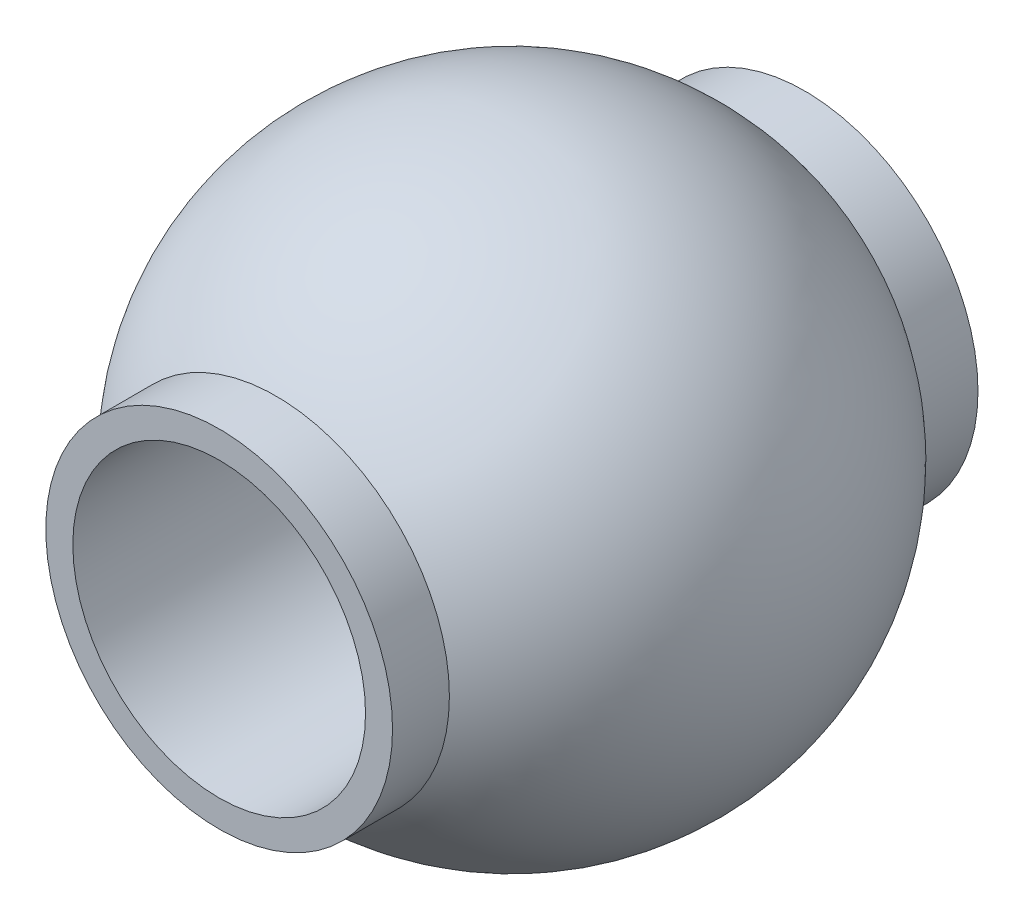
ISO-10303-21;
HEADER;
FILE_DESCRIPTION(('STEP AP214'),'2;1');
FILE_NAME('part.step','',(''),(''),'','','');
FILE_SCHEMA(('AUTOMOTIVE_DESIGN { 1 0 10303 214 1 1 1 1 }'));
ENDSEC;
DATA;
#1=APPLICATION_CONTEXT('core data for automotive mechanical design processes');
#2=APPLICATION_PROTOCOL_DEFINITION('international standard','automotive_design',2000,#1);
#3=PRODUCT_CONTEXT('',#1,'mechanical');
#4=PRODUCT('Part','Part','',(#3));
#5=PRODUCT_RELATED_PRODUCT_CATEGORY('part','',(#4));
#6=PRODUCT_DEFINITION_FORMATION('','',#4);
#7=PRODUCT_DEFINITION_CONTEXT('part definition',#1,'design');
#8=PRODUCT_DEFINITION('design','',#6,#7);
#9=PRODUCT_DEFINITION_SHAPE('','',#8);
#10=(LENGTH_UNIT() NAMED_UNIT(*) SI_UNIT(.MILLI.,.METRE.));
#11=(NAMED_UNIT(*) PLANE_ANGLE_UNIT() SI_UNIT($,.RADIAN.));
#12=(NAMED_UNIT(*) SI_UNIT($,.STERADIAN.) SOLID_ANGLE_UNIT());
#13=UNCERTAINTY_MEASURE_WITH_UNIT(LENGTH_MEASURE(1.E-05),#10,'distance_accuracy_value','');
#14=(GEOMETRIC_REPRESENTATION_CONTEXT(3) GLOBAL_UNCERTAINTY_ASSIGNED_CONTEXT((#13)) GLOBAL_UNIT_ASSIGNED_CONTEXT((#10,
#11,#12)) REPRESENTATION_CONTEXT('',''));
#15=CARTESIAN_POINT('',(0.,0.,0.));
#16=DIRECTION('',(0.,0.,1.));
#17=DIRECTION('',(1.,0.,0.));
#18=AXIS2_PLACEMENT_3D('',#15,#16,#17);
#19=CARTESIAN_POINT('',(0.,0.,0.));
#20=DIRECTION('',(0.,1.,0.));
#21=DIRECTION('',(1.,0.,0.));
#22=AXIS2_PLACEMENT_3D('',#19,#20,#21);
#23=SPHERICAL_SURFACE('',#22,3.);
#24=CARTESIAN_POINT('',(0.,0.,0.));
#25=DIRECTION('',(0.,0.,-1.));
#26=DIRECTION('',(-1.,0.,0.));
#27=AXIS2_PLACEMENT_3D('',#24,#25,#26);
#28=SPHERICAL_SURFACE('',#27,3.);
#29=CARTESIAN_POINT('',(0.,0.,2.41726372921671));
#30=DIRECTION('',(0.,0.,-1.));
#31=DIRECTION('',(-1.,0.,0.));
#32=AXIS2_PLACEMENT_3D('',#29,#30,#31);
#33=CIRCLE('',#32,1.77674873389946);
#34=CARTESIAN_POINT('',(-1.77674873389946,0.,2.41726372921671));
#35=VERTEX_POINT('',#34);
#36=EDGE_CURVE('E10',#35,#35,#33,.F.);
#37=ORIENTED_EDGE('',*,*,#36,.F.);
#38=EDGE_LOOP('',(#37));
#39=FACE_BOUND('',#38,.T.);
#40=CARTESIAN_POINT('',(0.,0.,-2.41726372921671));
#41=DIRECTION('',(0.,0.,1.));
#42=DIRECTION('',(1.,0.,0.));
#43=AXIS2_PLACEMENT_3D('',#40,#41,#42);
#44=CIRCLE('',#43,1.77674873389946);
#45=CARTESIAN_POINT('',(1.77674873389946,0.,-2.41726372921671));
#46=VERTEX_POINT('',#45);
#47=EDGE_CURVE('E37',#46,#46,#44,.F.);
#48=ORIENTED_EDGE('',*,*,#47,.F.);
#49=EDGE_LOOP('',(#48));
#50=FACE_BOUND('',#49,.T.);
#51=ADVANCED_FACE('F31',(#39,#50),#28,.T.);
#52=CARTESIAN_POINT('',(0.,0.,-3.));
#53=DIRECTION('',(0.,0.,1.));
#54=DIRECTION('',(1.,0.,0.));
#55=AXIS2_PLACEMENT_3D('',#52,#53,#54);
#56=CYLINDRICAL_SURFACE('',#55,1.77674873389946);
#57=ORIENTED_EDGE('',*,*,#47,.T.);
#58=EDGE_LOOP('',(#57));
#59=FACE_BOUND('',#58,.T.);
#60=CARTESIAN_POINT('',(0.,0.,-3.));
#61=DIRECTION('',(0.,0.,1.));
#62=DIRECTION('',(1.,0.,0.));
#63=AXIS2_PLACEMENT_3D('',#60,#61,#62);
#64=CIRCLE('',#63,1.77674873389946);
#65=CARTESIAN_POINT('',(1.77674873389946,0.,-3.));
#66=VERTEX_POINT('',#65);
#67=EDGE_CURVE('E41',#66,#66,#64,.T.);
#68=ORIENTED_EDGE('',*,*,#67,.T.);
#69=EDGE_LOOP('',(#68));
#70=FACE_BOUND('',#69,.T.);
#71=ADVANCED_FACE('F71',(#59,#70),#56,.T.);
#72=CARTESIAN_POINT('',(0.,0.,-3.));
#73=DIRECTION('',(0.,0.,1.));
#74=DIRECTION('',(1.,0.,0.));
#75=AXIS2_PLACEMENT_3D('',#72,#73,#74);
#76=PLANE('',#75);
#77=CARTESIAN_POINT('',(0.,0.,-3.));
#78=DIRECTION('',(0.,0.,1.));
#79=DIRECTION('',(1.,0.,0.));
#80=AXIS2_PLACEMENT_3D('',#77,#78,#79);
#81=CIRCLE('',#80,1.5);
#82=CARTESIAN_POINT('',(1.5,0.,-3.));
#83=VERTEX_POINT('',#82);
#84=EDGE_CURVE('E45',#83,#83,#81,.T.);
#85=ORIENTED_EDGE('',*,*,#84,.T.);
#86=EDGE_LOOP('',(#85));
#87=FACE_BOUND('',#86,.T.);
#88=ORIENTED_EDGE('',*,*,#67,.F.);
#89=EDGE_LOOP('',(#88));
#90=FACE_BOUND('',#89,.T.);
#91=ADVANCED_FACE('F69',(#87,#90),#76,.F.);
#92=ORIENTED_EDGE('',*,*,#36,.T.);
#93=EDGE_LOOP('',(#92));
#94=FACE_BOUND('',#93,.T.);
#95=CARTESIAN_POINT('',(0.,0.,3.));
#96=DIRECTION('',(0.,0.,1.));
#97=DIRECTION('',(1.,0.,0.));
#98=AXIS2_PLACEMENT_3D('',#95,#96,#97);
#99=CIRCLE('',#98,1.77674873389946);
#100=CARTESIAN_POINT('',(1.77674873389946,0.,3.));
#101=VERTEX_POINT('',#100);
#102=EDGE_CURVE('E50',#101,#101,#99,.T.);
#103=ORIENTED_EDGE('',*,*,#102,.F.);
#104=EDGE_LOOP('',(#103));
#105=FACE_BOUND('',#104,.T.);
#106=ADVANCED_FACE('F61',(#94,#105),#56,.T.);
#107=CARTESIAN_POINT('',(0.,0.,3.));
#108=DIRECTION('',(0.,0.,1.));
#109=DIRECTION('',(1.,0.,0.));
#110=AXIS2_PLACEMENT_3D('',#107,#108,#109);
#111=PLANE('',#110);
#112=ORIENTED_EDGE('',*,*,#102,.T.);
#113=EDGE_LOOP('',(#112));
#114=FACE_BOUND('',#113,.T.);
#115=CARTESIAN_POINT('',(0.,0.,3.));
#116=DIRECTION('',(0.,0.,1.));
#117=DIRECTION('',(1.,0.,0.));
#118=AXIS2_PLACEMENT_3D('',#115,#116,#117);
#119=CIRCLE('',#118,1.5);
#120=CARTESIAN_POINT('',(1.5,0.,3.));
#121=VERTEX_POINT('',#120);
#122=EDGE_CURVE('E53',#121,#121,#119,.T.);
#123=ORIENTED_EDGE('',*,*,#122,.F.);
#124=EDGE_LOOP('',(#123));
#125=FACE_BOUND('',#124,.T.);
#126=ADVANCED_FACE('F59',(#114,#125),#111,.T.);
#127=CARTESIAN_POINT('',(0.,0.,-3.));
#128=DIRECTION('',(0.,0.,1.));
#129=DIRECTION('',(1.,0.,0.));
#130=AXIS2_PLACEMENT_3D('',#127,#128,#129);
#131=CYLINDRICAL_SURFACE('',#130,1.5);
#132=CARTESIAN_POINT('',(1.5,0.,-3.));
#133=CARTESIAN_POINT('',(1.5,0.,-2.9375));
#134=CARTESIAN_POINT('',(1.5,0.,-2.875));
#135=CARTESIAN_POINT('',(1.5,0.,-2.75));
#136=CARTESIAN_POINT('',(1.5,0.,-2.6875));
#137=CARTESIAN_POINT('',(1.5,0.,-2.5625));
#138=CARTESIAN_POINT('',(1.5,0.,-2.5));
#139=CARTESIAN_POINT('',(1.5,0.,-2.375));
#140=CARTESIAN_POINT('',(1.5,0.,-2.3125));
#141=CARTESIAN_POINT('',(1.5,0.,-2.1875));
#142=CARTESIAN_POINT('',(1.5,0.,-2.125));
#143=CARTESIAN_POINT('',(1.5,0.,-2.));
#144=CARTESIAN_POINT('',(1.5,0.,-1.9375));
#145=CARTESIAN_POINT('',(1.5,0.,-1.8125));
#146=CARTESIAN_POINT('',(1.5,0.,-1.75));
#147=CARTESIAN_POINT('',(1.5,0.,-1.625));
#148=CARTESIAN_POINT('',(1.5,0.,-1.5625));
#149=CARTESIAN_POINT('',(1.5,0.,-1.4375));
#150=CARTESIAN_POINT('',(1.5,0.,-1.375));
#151=CARTESIAN_POINT('',(1.5,0.,-1.25));
#152=CARTESIAN_POINT('',(1.5,0.,-1.1875));
#153=CARTESIAN_POINT('',(1.5,0.,-1.0625));
#154=CARTESIAN_POINT('',(1.5,0.,-1.));
#155=CARTESIAN_POINT('',(1.5,0.,-0.875));
#156=CARTESIAN_POINT('',(1.5,0.,-0.8125));
#157=CARTESIAN_POINT('',(1.5,0.,-0.6875));
#158=CARTESIAN_POINT('',(1.5,0.,-0.625));
#159=CARTESIAN_POINT('',(1.5,0.,-0.5));
#160=CARTESIAN_POINT('',(1.5,0.,-0.4375));
#161=CARTESIAN_POINT('',(1.5,0.,-0.3125));
#162=CARTESIAN_POINT('',(1.5,0.,-0.25));
#163=CARTESIAN_POINT('',(1.5,0.,-0.125));
#164=CARTESIAN_POINT('',(1.5,0.,-0.0625000000000001));
#165=CARTESIAN_POINT('',(1.5,0.,0.0625000000000001));
#166=CARTESIAN_POINT('',(1.5,0.,0.125));
#167=CARTESIAN_POINT('',(1.5,0.,0.25));
#168=CARTESIAN_POINT('',(1.5,0.,0.3125));
#169=CARTESIAN_POINT('',(1.5,0.,0.4375));
#170=CARTESIAN_POINT('',(1.5,0.,0.5));
#171=CARTESIAN_POINT('',(1.5,0.,0.625));
#172=CARTESIAN_POINT('',(1.5,0.,0.6875));
#173=CARTESIAN_POINT('',(1.5,0.,0.8125));
#174=CARTESIAN_POINT('',(1.5,0.,0.875));
#175=CARTESIAN_POINT('',(1.5,0.,1.));
#176=CARTESIAN_POINT('',(1.5,0.,1.0625));
#177=CARTESIAN_POINT('',(1.5,0.,1.1875));
#178=CARTESIAN_POINT('',(1.5,0.,1.25));
#179=CARTESIAN_POINT('',(1.5,0.,1.375));
#180=CARTESIAN_POINT('',(1.5,0.,1.4375));
#181=CARTESIAN_POINT('',(1.5,0.,1.5625));
#182=CARTESIAN_POINT('',(1.5,0.,1.625));
#183=CARTESIAN_POINT('',(1.5,0.,1.75));
#184=CARTESIAN_POINT('',(1.5,0.,1.8125));
#185=CARTESIAN_POINT('',(1.5,0.,1.9375));
#186=CARTESIAN_POINT('',(1.5,0.,2.));
#187=CARTESIAN_POINT('',(1.5,0.,2.125));
#188=CARTESIAN_POINT('',(1.5,0.,2.1875));
#189=CARTESIAN_POINT('',(1.5,0.,2.3125));
#190=CARTESIAN_POINT('',(1.5,0.,2.375));
#191=CARTESIAN_POINT('',(1.5,0.,2.5));
#192=CARTESIAN_POINT('',(1.5,0.,2.5625));
#193=CARTESIAN_POINT('',(1.5,0.,2.6875));
#194=CARTESIAN_POINT('',(1.5,0.,2.75));
#195=CARTESIAN_POINT('',(1.5,0.,2.875));
#196=CARTESIAN_POINT('',(1.5,0.,2.9375));
#197=CARTESIAN_POINT('',(1.5,0.,3.));
#198=B_SPLINE_CURVE_WITH_KNOTS('',3,(#132,#133,#134,#135,#136,#137,#138,#139,#140,#141,#142,
#143,#144,#145,#146,#147,#148,#149,#150,#151,#152,#153,#154,#155,#156,#157,#158,#159,#160,#161,
#162,#163,#164,#165,#166,#167,#168,#169,#170,#171,#172,#173,#174,#175,#176,#177,#178,#179,#180,
#181,#182,#183,#184,#185,#186,#187,#188,#189,#190,#191,#192,#193,#194,#195,#196,#197),
.UNSPECIFIED.,.F.,.F.,(4,2,2,2,2,2,2,2,2,2,2,2,2,2,2,2,2,2,2,2,2,2,2,2,2,2,2,2,2,2,2,2,4),(0.,
0.1875,0.375,0.5625,0.75,0.9375,1.125,1.3125,1.5,1.6875,1.875,2.0625,2.25,2.4375,2.625,2.8125,
3.,3.1875,3.375,3.5625,3.75,3.9375,4.125,4.3125,4.5,4.6875,4.875,5.0625,5.25,5.4375,5.625,
5.8125,6.),.UNSPECIFIED.);
#199=EDGE_CURVE('BSEAM57',#83,#121,#198,.T.);
#200=ORIENTED_EDGE('',*,*,#84,.F.);
#201=ORIENTED_EDGE('',*,*,#122,.T.);
#202=ORIENTED_EDGE('',*,*,#199,.T.);
#203=ORIENTED_EDGE('',*,*,#199,.F.);
#204=EDGE_LOOP('',(#200,#202,#201,#203));
#205=FACE_BOUND('',#204,.T.);
#206=ADVANCED_FACE('F57',(#205),#131,.F.);
#207=CLOSED_SHELL('',(#51,#71,#91,#106,#126,#206));
#208=MANIFOLD_SOLID_BREP('B2',#207);
#209=ADVANCED_BREP_SHAPE_REPRESENTATION('',(#18,#208),#14);
#210=SHAPE_DEFINITION_REPRESENTATION(#9,#209);
ENDSEC;
END-ISO-10303-21;
